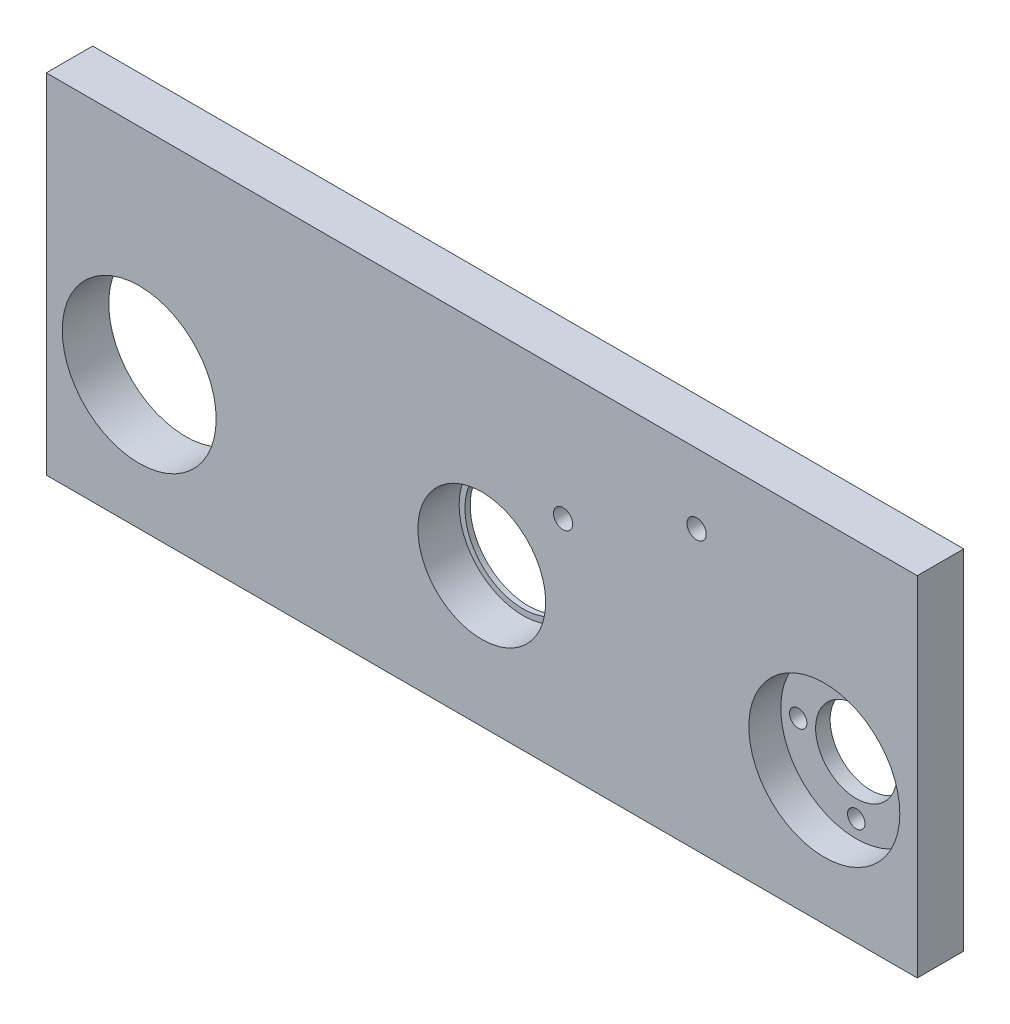
ISO-10303-21;
HEADER;
FILE_DESCRIPTION(('STEP AP214'),'2;1');
FILE_NAME('part.step','',(''),(''),'','','');
FILE_SCHEMA(('AUTOMOTIVE_DESIGN { 1 0 10303 214 1 1 1 1 }'));
ENDSEC;
DATA;
#1=APPLICATION_CONTEXT('core data for automotive mechanical design processes');
#2=APPLICATION_PROTOCOL_DEFINITION('international standard','automotive_design',2000,#1);
#3=PRODUCT_CONTEXT('',#1,'mechanical');
#4=PRODUCT('Part','Part','',(#3));
#5=PRODUCT_RELATED_PRODUCT_CATEGORY('part','',(#4));
#6=PRODUCT_DEFINITION_FORMATION('','',#4);
#7=PRODUCT_DEFINITION_CONTEXT('part definition',#1,'design');
#8=PRODUCT_DEFINITION('design','',#6,#7);
#9=PRODUCT_DEFINITION_SHAPE('','',#8);
#10=(LENGTH_UNIT() NAMED_UNIT(*) SI_UNIT(.MILLI.,.METRE.));
#11=(NAMED_UNIT(*) PLANE_ANGLE_UNIT() SI_UNIT($,.RADIAN.));
#12=(NAMED_UNIT(*) SI_UNIT($,.STERADIAN.) SOLID_ANGLE_UNIT());
#13=UNCERTAINTY_MEASURE_WITH_UNIT(LENGTH_MEASURE(1.E-05),#10,'distance_accuracy_value','');
#14=(GEOMETRIC_REPRESENTATION_CONTEXT(3) GLOBAL_UNCERTAINTY_ASSIGNED_CONTEXT((#13)) GLOBAL_UNIT_ASSIGNED_CONTEXT((#10,
#11,#12)) REPRESENTATION_CONTEXT('',''));
#15=CARTESIAN_POINT('',(0.,0.,0.));
#16=DIRECTION('',(0.,0.,1.));
#17=DIRECTION('',(1.,0.,0.));
#18=AXIS2_PLACEMENT_3D('',#15,#16,#17);
#19=CARTESIAN_POINT('',(133.991524815011,23.,0.));
#20=DIRECTION('',(0.,0.,1.));
#21=DIRECTION('',(1.,0.,0.));
#22=AXIS2_PLACEMENT_3D('',#19,#20,#21);
#23=CYLINDRICAL_SURFACE('',#22,7.00000000000001);
#24=CARTESIAN_POINT('',(133.991524815011,23.,0.));
#25=DIRECTION('',(0.,0.,1.));
#26=DIRECTION('',(1.,0.,0.));
#27=AXIS2_PLACEMENT_3D('',#24,#25,#26);
#28=CIRCLE('',#27,7.00000000000001);
#29=CARTESIAN_POINT('',(140.991524815011,23.,0.));
#30=VERTEX_POINT('',#29);
#31=EDGE_CURVE('E115',#30,#30,#28,.T.);
#32=ORIENTED_EDGE('',*,*,#31,.F.);
#33=EDGE_LOOP('',(#32));
#34=FACE_BOUND('',#33,.T.);
#35=CARTESIAN_POINT('',(133.991524815011,23.,2.5));
#36=DIRECTION('',(0.,0.,1.));
#37=DIRECTION('',(1.,0.,0.));
#38=AXIS2_PLACEMENT_3D('',#35,#36,#37);
#39=CIRCLE('',#38,7.00000000000001);
#40=CARTESIAN_POINT('',(140.991524815011,23.,2.5));
#41=VERTEX_POINT('',#40);
#42=EDGE_CURVE('E112',#41,#41,#39,.F.);
#43=ORIENTED_EDGE('',*,*,#42,.F.);
#44=EDGE_LOOP('',(#43));
#45=FACE_BOUND('',#44,.T.);
#46=ADVANCED_FACE('F33',(#34,#45),#23,.F.);
#47=CARTESIAN_POINT('',(0.,0.,8.));
#48=DIRECTION('',(1.,0.,0.));
#49=DIRECTION('',(0.,0.,-1.));
#50=AXIS2_PLACEMENT_3D('',#47,#48,#49);
#51=PLANE('',#50);
#52=DIRECTION('',(0.,-1.,0.));
#53=VECTOR('',#52,1.);
#54=CARTESIAN_POINT('',(0.,0.,0.));
#55=LINE('',#54,#53);
#56=CARTESIAN_POINT('',(0.,60.,0.));
#57=VERTEX_POINT('',#56);
#58=CARTESIAN_POINT('',(0.,0.,0.));
#59=VERTEX_POINT('',#58);
#60=EDGE_CURVE('E100',#57,#59,#55,.T.);
#61=ORIENTED_EDGE('',*,*,#60,.T.);
#62=DIRECTION('',(0.,0.,-1.));
#63=VECTOR('',#62,1.);
#64=CARTESIAN_POINT('',(0.,0.,8.));
#65=LINE('',#64,#63);
#66=CARTESIAN_POINT('',(0.,0.,8.));
#67=VERTEX_POINT('',#66);
#68=EDGE_CURVE('E11',#67,#59,#65,.T.);
#69=ORIENTED_EDGE('',*,*,#68,.F.);
#70=DIRECTION('',(0.,-1.,0.));
#71=VECTOR('',#70,1.);
#72=CARTESIAN_POINT('',(0.,0.,8.));
#73=LINE('',#72,#71);
#74=CARTESIAN_POINT('',(0.,60.,8.));
#75=VERTEX_POINT('',#74);
#76=EDGE_CURVE('E87',#75,#67,#73,.T.);
#77=ORIENTED_EDGE('',*,*,#76,.F.);
#78=DIRECTION('',(0.,0.,-1.));
#79=VECTOR('',#78,1.);
#80=CARTESIAN_POINT('',(0.,60.,8.));
#81=LINE('',#80,#79);
#82=EDGE_CURVE('E96',#75,#57,#81,.T.);
#83=ORIENTED_EDGE('',*,*,#82,.T.);
#84=EDGE_LOOP('',(#61,#69,#77,#83));
#85=FACE_BOUND('',#84,.T.);
#86=ADVANCED_FACE('F35',(#85),#51,.F.);
#87=CARTESIAN_POINT('',(0.,0.,8.));
#88=DIRECTION('',(0.,1.,0.));
#89=DIRECTION('',(0.,0.,1.));
#90=AXIS2_PLACEMENT_3D('',#87,#88,#89);
#91=PLANE('',#90);
#92=DIRECTION('',(1.,0.,0.));
#93=VECTOR('',#92,1.);
#94=CARTESIAN_POINT('',(0.,0.,0.));
#95=LINE('',#94,#93);
#96=CARTESIAN_POINT('',(150.,0.,0.));
#97=VERTEX_POINT('',#96);
#98=EDGE_CURVE('E91',#59,#97,#95,.T.);
#99=ORIENTED_EDGE('',*,*,#98,.T.);
#100=DIRECTION('',(0.,0.,-1.));
#101=VECTOR('',#100,1.);
#102=CARTESIAN_POINT('',(150.,0.,8.));
#103=LINE('',#102,#101);
#104=CARTESIAN_POINT('',(150.,0.,8.));
#105=VERTEX_POINT('',#104);
#106=EDGE_CURVE('E43',#105,#97,#103,.T.);
#107=ORIENTED_EDGE('',*,*,#106,.F.);
#108=DIRECTION('',(1.,0.,0.));
#109=VECTOR('',#108,1.);
#110=CARTESIAN_POINT('',(0.,0.,8.));
#111=LINE('',#110,#109);
#112=EDGE_CURVE('E82',#67,#105,#111,.T.);
#113=ORIENTED_EDGE('',*,*,#112,.F.);
#114=ORIENTED_EDGE('',*,*,#68,.T.);
#115=EDGE_LOOP('',(#99,#107,#113,#114));
#116=FACE_BOUND('',#115,.T.);
#117=ADVANCED_FACE('F90',(#116),#91,.F.);
#118=CARTESIAN_POINT('',(150.,0.,8.));
#119=DIRECTION('',(-1.,0.,0.));
#120=DIRECTION('',(0.,0.,1.));
#121=AXIS2_PLACEMENT_3D('',#118,#119,#120);
#122=PLANE('',#121);
#123=DIRECTION('',(0.,1.,0.));
#124=VECTOR('',#123,1.);
#125=CARTESIAN_POINT('',(150.,0.,0.));
#126=LINE('',#125,#124);
#127=CARTESIAN_POINT('',(150.,60.,0.));
#128=VERTEX_POINT('',#127);
#129=EDGE_CURVE('E69',#97,#128,#126,.T.);
#130=ORIENTED_EDGE('',*,*,#129,.T.);
#131=DIRECTION('',(0.,0.,-1.));
#132=VECTOR('',#131,1.);
#133=CARTESIAN_POINT('',(150.,60.,8.));
#134=LINE('',#133,#132);
#135=CARTESIAN_POINT('',(150.,60.,8.));
#136=VERTEX_POINT('',#135);
#137=EDGE_CURVE('E92',#136,#128,#134,.T.);
#138=ORIENTED_EDGE('',*,*,#137,.F.);
#139=DIRECTION('',(0.,1.,0.));
#140=VECTOR('',#139,1.);
#141=CARTESIAN_POINT('',(150.,0.,8.));
#142=LINE('',#141,#140);
#143=EDGE_CURVE('E85',#105,#136,#142,.T.);
#144=ORIENTED_EDGE('',*,*,#143,.F.);
#145=ORIENTED_EDGE('',*,*,#106,.T.);
#146=EDGE_LOOP('',(#130,#138,#144,#145));
#147=FACE_BOUND('',#146,.T.);
#148=ADVANCED_FACE('F94',(#147),#122,.F.);
#149=CARTESIAN_POINT('',(0.,60.,8.));
#150=DIRECTION('',(0.,-1.,0.));
#151=DIRECTION('',(0.,0.,-1.));
#152=AXIS2_PLACEMENT_3D('',#149,#150,#151);
#153=PLANE('',#152);
#154=DIRECTION('',(-1.,0.,0.));
#155=VECTOR('',#154,1.);
#156=CARTESIAN_POINT('',(0.,60.,0.));
#157=LINE('',#156,#155);
#158=EDGE_CURVE('E75',#128,#57,#157,.T.);
#159=ORIENTED_EDGE('',*,*,#158,.T.);
#160=ORIENTED_EDGE('',*,*,#82,.F.);
#161=DIRECTION('',(-1.,0.,0.));
#162=VECTOR('',#161,1.);
#163=CARTESIAN_POINT('',(0.,60.,8.));
#164=LINE('',#163,#162);
#165=EDGE_CURVE('E52',#136,#75,#164,.T.);
#166=ORIENTED_EDGE('',*,*,#165,.F.);
#167=ORIENTED_EDGE('',*,*,#137,.T.);
#168=EDGE_LOOP('',(#159,#160,#166,#167));
#169=FACE_BOUND('',#168,.T.);
#170=ADVANCED_FACE('F183',(#169),#153,.F.);
#171=CARTESIAN_POINT('',(0.,0.,8.));
#172=DIRECTION('',(0.,0.,-1.));
#173=DIRECTION('',(-1.,0.,0.));
#174=AXIS2_PLACEMENT_3D('',#171,#172,#173);
#175=PLANE('',#174);
#176=CARTESIAN_POINT('',(112.,48.,8.));
#177=DIRECTION('',(0.,0.,-1.));
#178=DIRECTION('',(-1.,0.,0.));
#179=AXIS2_PLACEMENT_3D('',#176,#177,#178);
#180=CIRCLE('',#179,1.65);
#181=CARTESIAN_POINT('',(110.35,48.,8.));
#182=VERTEX_POINT('',#181);
#183=EDGE_CURVE('E142',#182,#182,#180,.T.);
#184=ORIENTED_EDGE('',*,*,#183,.T.);
#185=EDGE_LOOP('',(#184));
#186=FACE_BOUND('',#185,.T.);
#187=CARTESIAN_POINT('',(89.,38.,8.));
#188=DIRECTION('',(0.,0.,-1.));
#189=DIRECTION('',(-1.,0.,0.));
#190=AXIS2_PLACEMENT_3D('',#187,#188,#189);
#191=CIRCLE('',#190,1.65);
#192=CARTESIAN_POINT('',(87.35,38.,8.));
#193=VERTEX_POINT('',#192);
#194=EDGE_CURVE('E148',#193,#193,#191,.T.);
#195=ORIENTED_EDGE('',*,*,#194,.T.);
#196=EDGE_LOOP('',(#195));
#197=FACE_BOUND('',#196,.T.);
#198=CARTESIAN_POINT('',(16.0084751849895,23.,8.));
#199=DIRECTION('',(0.,0.,-1.));
#200=DIRECTION('',(-1.,0.,0.));
#201=AXIS2_PLACEMENT_3D('',#198,#199,#200);
#202=CIRCLE('',#201,13.25);
#203=CARTESIAN_POINT('',(2.7584751849895,23.,8.));
#204=VERTEX_POINT('',#203);
#205=EDGE_CURVE('E154',#204,#204,#202,.T.);
#206=ORIENTED_EDGE('',*,*,#205,.T.);
#207=EDGE_LOOP('',(#206));
#208=FACE_BOUND('',#207,.T.);
#209=CARTESIAN_POINT('',(133.991524815011,23.,8.));
#210=DIRECTION('',(0.,0.,1.));
#211=DIRECTION('',(1.,0.,0.));
#212=AXIS2_PLACEMENT_3D('',#209,#210,#211);
#213=CIRCLE('',#212,13.);
#214=CARTESIAN_POINT('',(146.991524815011,23.,8.));
#215=VERTEX_POINT('',#214);
#216=EDGE_CURVE('E157',#215,#215,#213,.T.);
#217=ORIENTED_EDGE('',*,*,#216,.F.);
#218=EDGE_LOOP('',(#217));
#219=FACE_BOUND('',#218,.T.);
#220=CARTESIAN_POINT('',(75.,24.,8.));
#221=DIRECTION('',(0.,0.,-1.));
#222=DIRECTION('',(-1.,0.,0.));
#223=AXIS2_PLACEMENT_3D('',#220,#221,#222);
#224=CIRCLE('',#223,11.);
#225=CARTESIAN_POINT('',(64.,24.,8.));
#226=VERTEX_POINT('',#225);
#227=EDGE_CURVE('E103',#226,#226,#224,.F.);
#228=ORIENTED_EDGE('',*,*,#227,.F.);
#229=EDGE_LOOP('',(#228));
#230=FACE_BOUND('',#229,.T.);
#231=ORIENTED_EDGE('',*,*,#76,.T.);
#232=ORIENTED_EDGE('',*,*,#112,.T.);
#233=ORIENTED_EDGE('',*,*,#143,.T.);
#234=ORIENTED_EDGE('',*,*,#165,.T.);
#235=EDGE_LOOP('',(#231,#232,#233,#234));
#236=FACE_BOUND('',#235,.T.);
#237=ADVANCED_FACE('F83',(#186,#197,#208,#219,#230,#236),#175,.F.);
#238=CARTESIAN_POINT('',(0.,0.,0.));
#239=DIRECTION('',(0.,0.,-1.));
#240=DIRECTION('',(-1.,0.,0.));
#241=AXIS2_PLACEMENT_3D('',#238,#239,#240);
#242=PLANE('',#241);
#243=CARTESIAN_POINT('',(123.99152481501,23.,0.));
#244=DIRECTION('',(0.,0.,1.));
#245=DIRECTION('',(1.,0.,0.));
#246=AXIS2_PLACEMENT_3D('',#243,#244,#245);
#247=CIRCLE('',#246,1.5);
#248=CARTESIAN_POINT('',(125.49152481501,23.,0.));
#249=VERTEX_POINT('',#248);
#250=EDGE_CURVE('E125',#249,#249,#247,.T.);
#251=ORIENTED_EDGE('',*,*,#250,.T.);
#252=EDGE_LOOP('',(#251));
#253=FACE_BOUND('',#252,.T.);
#254=CARTESIAN_POINT('',(133.991524815011,33.,0.));
#255=DIRECTION('',(0.,0.,1.));
#256=DIRECTION('',(1.,0.,0.));
#257=AXIS2_PLACEMENT_3D('',#254,#255,#256);
#258=CIRCLE('',#257,1.5);
#259=CARTESIAN_POINT('',(135.491524815011,33.,0.));
#260=VERTEX_POINT('',#259);
#261=EDGE_CURVE('E315',#260,#260,#258,.T.);
#262=ORIENTED_EDGE('',*,*,#261,.T.);
#263=EDGE_LOOP('',(#262));
#264=FACE_BOUND('',#263,.T.);
#265=CARTESIAN_POINT('',(143.99152481501,23.,0.));
#266=DIRECTION('',(0.,0.,1.));
#267=DIRECTION('',(1.,0.,0.));
#268=AXIS2_PLACEMENT_3D('',#265,#266,#267);
#269=CIRCLE('',#268,1.5);
#270=CARTESIAN_POINT('',(145.49152481501,23.,0.));
#271=VERTEX_POINT('',#270);
#272=EDGE_CURVE('E138',#271,#271,#269,.T.);
#273=ORIENTED_EDGE('',*,*,#272,.T.);
#274=EDGE_LOOP('',(#273));
#275=FACE_BOUND('',#274,.T.);
#276=CARTESIAN_POINT('',(133.991524815011,13.,0.));
#277=DIRECTION('',(0.,0.,1.));
#278=DIRECTION('',(1.,0.,0.));
#279=AXIS2_PLACEMENT_3D('',#276,#277,#278);
#280=CIRCLE('',#279,1.5);
#281=CARTESIAN_POINT('',(135.491524815011,13.,0.));
#282=VERTEX_POINT('',#281);
#283=EDGE_CURVE('E121',#282,#282,#280,.T.);
#284=ORIENTED_EDGE('',*,*,#283,.T.);
#285=EDGE_LOOP('',(#284));
#286=FACE_BOUND('',#285,.T.);
#287=CARTESIAN_POINT('',(112.,48.,0.));
#288=DIRECTION('',(0.,0.,1.));
#289=DIRECTION('',(1.,0.,0.));
#290=AXIS2_PLACEMENT_3D('',#287,#288,#289);
#291=CIRCLE('',#290,1.65);
#292=CARTESIAN_POINT('',(113.65,48.,0.));
#293=VERTEX_POINT('',#292);
#294=EDGE_CURVE('E120',#293,#293,#291,.T.);
#295=ORIENTED_EDGE('',*,*,#294,.T.);
#296=EDGE_LOOP('',(#295));
#297=FACE_BOUND('',#296,.T.);
#298=CARTESIAN_POINT('',(89.,38.,0.));
#299=DIRECTION('',(0.,0.,1.));
#300=DIRECTION('',(1.,0.,0.));
#301=AXIS2_PLACEMENT_3D('',#298,#299,#300);
#302=CIRCLE('',#301,1.65);
#303=CARTESIAN_POINT('',(90.65,38.,0.));
#304=VERTEX_POINT('',#303);
#305=EDGE_CURVE('E145',#304,#304,#302,.T.);
#306=ORIENTED_EDGE('',*,*,#305,.T.);
#307=EDGE_LOOP('',(#306));
#308=FACE_BOUND('',#307,.T.);
#309=CARTESIAN_POINT('',(16.0084751849895,23.,0.));
#310=DIRECTION('',(0.,0.,1.));
#311=DIRECTION('',(1.,0.,0.));
#312=AXIS2_PLACEMENT_3D('',#309,#310,#311);
#313=CIRCLE('',#312,13.25);
#314=CARTESIAN_POINT('',(29.2584751849895,23.,0.));
#315=VERTEX_POINT('',#314);
#316=EDGE_CURVE('E151',#315,#315,#313,.T.);
#317=ORIENTED_EDGE('',*,*,#316,.T.);
#318=EDGE_LOOP('',(#317));
#319=FACE_BOUND('',#318,.T.);
#320=ORIENTED_EDGE('',*,*,#31,.T.);
#321=EDGE_LOOP('',(#320));
#322=FACE_BOUND('',#321,.T.);
#323=CARTESIAN_POINT('',(75.,24.,0.));
#324=DIRECTION('',(0.,0.,1.));
#325=DIRECTION('',(1.,0.,0.));
#326=AXIS2_PLACEMENT_3D('',#323,#324,#325);
#327=CIRCLE('',#326,9.99999999999999);
#328=CARTESIAN_POINT('',(85.,24.,0.));
#329=VERTEX_POINT('',#328);
#330=EDGE_CURVE('E165',#329,#329,#327,.T.);
#331=ORIENTED_EDGE('',*,*,#330,.T.);
#332=EDGE_LOOP('',(#331));
#333=FACE_BOUND('',#332,.T.);
#334=ORIENTED_EDGE('',*,*,#60,.F.);
#335=ORIENTED_EDGE('',*,*,#158,.F.);
#336=ORIENTED_EDGE('',*,*,#129,.F.);
#337=ORIENTED_EDGE('',*,*,#98,.F.);
#338=EDGE_LOOP('',(#334,#335,#336,#337));
#339=FACE_BOUND('',#338,.T.);
#340=ADVANCED_FACE('F178',(#253,#264,#275,#286,#297,#308,#319,#322,#333,#339),#242,.T.);
#341=CARTESIAN_POINT('',(75.,24.,8.000012));
#342=DIRECTION('',(0.,0.,-1.));
#343=DIRECTION('',(-1.,0.,0.));
#344=AXIS2_PLACEMENT_3D('',#341,#342,#343);
#345=CYLINDRICAL_SURFACE('',#344,11.);
#346=CARTESIAN_POINT('',(75.,24.,0.900000000000001));
#347=DIRECTION('',(0.,0.,1.));
#348=DIRECTION('',(1.,0.,0.));
#349=AXIS2_PLACEMENT_3D('',#346,#347,#348);
#350=CIRCLE('',#349,11.);
#351=CARTESIAN_POINT('',(64.,24.,0.900000000000001));
#352=VERTEX_POINT('',#351);
#353=EDGE_CURVE('E111',#352,#352,#350,.T.);
#354=CARTESIAN_POINT('',(64.,24.,0.900000000000001));
#355=CARTESIAN_POINT('',(64.,24.,0.973958333333334));
#356=CARTESIAN_POINT('',(64.,24.,1.04791666666667));
#357=CARTESIAN_POINT('',(64.,24.,1.19583333333333));
#358=CARTESIAN_POINT('',(64.,24.,1.26979166666667));
#359=CARTESIAN_POINT('',(64.,24.,1.41770833333333));
#360=CARTESIAN_POINT('',(64.,24.,1.49166666666667));
#361=CARTESIAN_POINT('',(64.,24.,1.63958333333333));
#362=CARTESIAN_POINT('',(64.,24.,1.71354166666667));
#363=CARTESIAN_POINT('',(64.,24.,1.86145833333333));
#364=CARTESIAN_POINT('',(64.,24.,1.93541666666667));
#365=CARTESIAN_POINT('',(64.,24.,2.08333333333333));
#366=CARTESIAN_POINT('',(64.,24.,2.15729166666667));
#367=CARTESIAN_POINT('',(64.,24.,2.30520833333333));
#368=CARTESIAN_POINT('',(64.,24.,2.37916666666667));
#369=CARTESIAN_POINT('',(64.,24.,2.52708333333333));
#370=CARTESIAN_POINT('',(64.,24.,2.60104166666667));
#371=CARTESIAN_POINT('',(64.,24.,2.74895833333333));
#372=CARTESIAN_POINT('',(64.,24.,2.82291666666667));
#373=CARTESIAN_POINT('',(64.,24.,2.97083333333333));
#374=CARTESIAN_POINT('',(64.,24.,3.04479166666667));
#375=CARTESIAN_POINT('',(64.,24.,3.19270833333333));
#376=CARTESIAN_POINT('',(64.,24.,3.26666666666667));
#377=CARTESIAN_POINT('',(64.,24.,3.41458333333333));
#378=CARTESIAN_POINT('',(64.,24.,3.48854166666667));
#379=CARTESIAN_POINT('',(64.,24.,3.63645833333333));
#380=CARTESIAN_POINT('',(64.,24.,3.71041666666667));
#381=CARTESIAN_POINT('',(64.,24.,3.85833333333333));
#382=CARTESIAN_POINT('',(64.,24.,3.93229166666667));
#383=CARTESIAN_POINT('',(64.,24.,4.08020833333333));
#384=CARTESIAN_POINT('',(64.,24.,4.15416666666667));
#385=CARTESIAN_POINT('',(64.,24.,4.30208333333333));
#386=CARTESIAN_POINT('',(64.,24.,4.37604166666667));
#387=CARTESIAN_POINT('',(64.,24.,4.52395833333333));
#388=CARTESIAN_POINT('',(64.,24.,4.59791666666667));
#389=CARTESIAN_POINT('',(64.,24.,4.74583333333333));
#390=CARTESIAN_POINT('',(64.,24.,4.81979166666667));
#391=CARTESIAN_POINT('',(64.,24.,4.96770833333333));
#392=CARTESIAN_POINT('',(64.,24.,5.04166666666667));
#393=CARTESIAN_POINT('',(64.,24.,5.18958333333333));
#394=CARTESIAN_POINT('',(64.,24.,5.26354166666667));
#395=CARTESIAN_POINT('',(64.,24.,5.41145833333333));
#396=CARTESIAN_POINT('',(64.,24.,5.48541666666667));
#397=CARTESIAN_POINT('',(64.,24.,5.63333333333333));
#398=CARTESIAN_POINT('',(64.,24.,5.70729166666667));
#399=CARTESIAN_POINT('',(64.,24.,5.85520833333333));
#400=CARTESIAN_POINT('',(64.,24.,5.92916666666667));
#401=CARTESIAN_POINT('',(64.,24.,6.07708333333333));
#402=CARTESIAN_POINT('',(64.,24.,6.15104166666667));
#403=CARTESIAN_POINT('',(64.,24.,6.29895833333333));
#404=CARTESIAN_POINT('',(64.,24.,6.37291666666667));
#405=CARTESIAN_POINT('',(64.,24.,6.52083333333333));
#406=CARTESIAN_POINT('',(64.,24.,6.59479166666667));
#407=CARTESIAN_POINT('',(64.,24.,6.74270833333333));
#408=CARTESIAN_POINT('',(64.,24.,6.81666666666667));
#409=CARTESIAN_POINT('',(64.,24.,6.96458333333333));
#410=CARTESIAN_POINT('',(64.,24.,7.03854166666667));
#411=CARTESIAN_POINT('',(64.,24.,7.18645833333333));
#412=CARTESIAN_POINT('',(64.,24.,7.26041666666667));
#413=CARTESIAN_POINT('',(64.,24.,7.40833333333333));
#414=CARTESIAN_POINT('',(64.,24.,7.48229166666667));
#415=CARTESIAN_POINT('',(64.,24.,7.63020833333333));
#416=CARTESIAN_POINT('',(64.,24.,7.70416666666667));
#417=CARTESIAN_POINT('',(64.,24.,7.85208333333333));
#418=CARTESIAN_POINT('',(64.,24.,7.92604166666667));
#419=CARTESIAN_POINT('',(64.,24.,8.));
#420=B_SPLINE_CURVE_WITH_KNOTS('',3,(#354,#355,#356,#357,#358,#359,#360,#361,#362,#363,#364,
#365,#366,#367,#368,#369,#370,#371,#372,#373,#374,#375,#376,#377,#378,#379,#380,#381,#382,#383,
#384,#385,#386,#387,#388,#389,#390,#391,#392,#393,#394,#395,#396,#397,#398,#399,#400,#401,#402,
#403,#404,#405,#406,#407,#408,#409,#410,#411,#412,#413,#414,#415,#416,#417,#418,#419),
.UNSPECIFIED.,.F.,.F.,(4,2,2,2,2,2,2,2,2,2,2,2,2,2,2,2,2,2,2,2,2,2,2,2,2,2,2,2,2,2,2,2,4),(0.,
0.221875,0.44375,0.665625,0.8875,1.109375,1.33125,1.553125,1.775,1.996875,2.21875,2.440625,
2.6625,2.884375,3.10625,3.328125,3.55,3.771875,3.99375,4.215625,4.4375,4.659375,4.88125,
5.103125,5.325,5.546875,5.76875,5.990625,6.2125,6.434375,6.65625,6.878125,7.1),.UNSPECIFIED.);
#421=EDGE_CURVE('BSEAM175',#352,#226,#420,.T.);
#422=ORIENTED_EDGE('',*,*,#353,.F.);
#423=ORIENTED_EDGE('',*,*,#227,.T.);
#424=ORIENTED_EDGE('',*,*,#421,.T.);
#425=ORIENTED_EDGE('',*,*,#421,.F.);
#426=EDGE_LOOP('',(#422,#424,#423,#425));
#427=FACE_BOUND('',#426,.T.);
#428=ADVANCED_FACE('F175',(#427),#345,.F.);
#429=CARTESIAN_POINT('',(75.,24.,0.900000000000001));
#430=DIRECTION('',(0.,0.,1.));
#431=DIRECTION('',(1.,0.,0.));
#432=AXIS2_PLACEMENT_3D('',#429,#430,#431);
#433=PLANE('',#432);
#434=CARTESIAN_POINT('',(75.,24.,0.900000000000001));
#435=DIRECTION('',(0.,0.,1.));
#436=DIRECTION('',(1.,0.,0.));
#437=AXIS2_PLACEMENT_3D('',#434,#435,#436);
#438=CIRCLE('',#437,9.99999999999999);
#439=CARTESIAN_POINT('',(85.,24.,0.900000000000001));
#440=VERTEX_POINT('',#439);
#441=EDGE_CURVE('E164',#440,#440,#438,.T.);
#442=ORIENTED_EDGE('',*,*,#441,.F.);
#443=EDGE_LOOP('',(#442));
#444=FACE_BOUND('',#443,.T.);
#445=ORIENTED_EDGE('',*,*,#353,.T.);
#446=EDGE_LOOP('',(#445));
#447=FACE_BOUND('',#446,.T.);
#448=ADVANCED_FACE('F173',(#444,#447),#433,.T.);
#449=CARTESIAN_POINT('',(75.,24.,0.));
#450=DIRECTION('',(0.,0.,1.));
#451=DIRECTION('',(1.,0.,0.));
#452=AXIS2_PLACEMENT_3D('',#449,#450,#451);
#453=CYLINDRICAL_SURFACE('',#452,9.99999999999999);
#454=ORIENTED_EDGE('',*,*,#330,.F.);
#455=EDGE_LOOP('',(#454));
#456=FACE_BOUND('',#455,.T.);
#457=ORIENTED_EDGE('',*,*,#441,.T.);
#458=EDGE_LOOP('',(#457));
#459=FACE_BOUND('',#458,.T.);
#460=ADVANCED_FACE('F209',(#456,#459),#453,.F.);
#461=CARTESIAN_POINT('',(133.991524815011,23.,2.5));
#462=DIRECTION('',(0.,0.,1.));
#463=DIRECTION('',(1.,0.,0.));
#464=AXIS2_PLACEMENT_3D('',#461,#462,#463);
#465=PLANE('',#464);
#466=CARTESIAN_POINT('',(123.99152481501,23.,2.5));
#467=DIRECTION('',(0.,0.,1.));
#468=DIRECTION('',(1.,0.,0.));
#469=AXIS2_PLACEMENT_3D('',#466,#467,#468);
#470=CIRCLE('',#469,1.5);
#471=CARTESIAN_POINT('',(125.49152481501,23.,2.5));
#472=VERTEX_POINT('',#471);
#473=EDGE_CURVE('E37',#472,#472,#470,.T.);
#474=ORIENTED_EDGE('',*,*,#473,.F.);
#475=EDGE_LOOP('',(#474));
#476=FACE_BOUND('',#475,.T.);
#477=CARTESIAN_POINT('',(133.991524815011,33.,2.5));
#478=DIRECTION('',(0.,0.,1.));
#479=DIRECTION('',(1.,0.,0.));
#480=AXIS2_PLACEMENT_3D('',#477,#478,#479);
#481=CIRCLE('',#480,1.5);
#482=CARTESIAN_POINT('',(135.491524815011,33.,2.5));
#483=VERTEX_POINT('',#482);
#484=EDGE_CURVE('E124',#483,#483,#481,.T.);
#485=ORIENTED_EDGE('',*,*,#484,.F.);
#486=EDGE_LOOP('',(#485));
#487=FACE_BOUND('',#486,.T.);
#488=CARTESIAN_POINT('',(143.99152481501,23.,2.5));
#489=DIRECTION('',(0.,0.,1.));
#490=DIRECTION('',(1.,0.,0.));
#491=AXIS2_PLACEMENT_3D('',#488,#489,#490);
#492=CIRCLE('',#491,1.5);
#493=CARTESIAN_POINT('',(145.49152481501,23.,2.5));
#494=VERTEX_POINT('',#493);
#495=EDGE_CURVE('E122',#494,#494,#492,.T.);
#496=ORIENTED_EDGE('',*,*,#495,.F.);
#497=EDGE_LOOP('',(#496));
#498=FACE_BOUND('',#497,.T.);
#499=CARTESIAN_POINT('',(133.991524815011,13.,2.5));
#500=DIRECTION('',(0.,0.,1.));
#501=DIRECTION('',(1.,0.,0.));
#502=AXIS2_PLACEMENT_3D('',#499,#500,#501);
#503=CIRCLE('',#502,1.5);
#504=CARTESIAN_POINT('',(135.491524815011,13.,2.5));
#505=VERTEX_POINT('',#504);
#506=EDGE_CURVE('E117',#505,#505,#503,.T.);
#507=ORIENTED_EDGE('',*,*,#506,.F.);
#508=EDGE_LOOP('',(#507));
#509=FACE_BOUND('',#508,.T.);
#510=CARTESIAN_POINT('',(133.991524815011,23.,2.5));
#511=DIRECTION('',(0.,0.,1.));
#512=DIRECTION('',(1.,0.,0.));
#513=AXIS2_PLACEMENT_3D('',#510,#511,#512);
#514=CIRCLE('',#513,13.);
#515=CARTESIAN_POINT('',(146.991524815011,23.,2.5));
#516=VERTEX_POINT('',#515);
#517=EDGE_CURVE('E116',#516,#516,#514,.T.);
#518=ORIENTED_EDGE('',*,*,#517,.T.);
#519=EDGE_LOOP('',(#518));
#520=FACE_BOUND('',#519,.T.);
#521=ORIENTED_EDGE('',*,*,#42,.T.);
#522=EDGE_LOOP('',(#521));
#523=FACE_BOUND('',#522,.T.);
#524=ADVANCED_FACE('F212',(#476,#487,#498,#509,#520,#523),#465,.T.);
#525=CARTESIAN_POINT('',(133.991524815011,23.,2.5));
#526=DIRECTION('',(0.,0.,1.));
#527=DIRECTION('',(1.,0.,0.));
#528=AXIS2_PLACEMENT_3D('',#525,#526,#527);
#529=CYLINDRICAL_SURFACE('',#528,13.);
#530=ORIENTED_EDGE('',*,*,#517,.F.);
#531=EDGE_LOOP('',(#530));
#532=FACE_BOUND('',#531,.T.);
#533=ORIENTED_EDGE('',*,*,#216,.T.);
#534=EDGE_LOOP('',(#533));
#535=FACE_BOUND('',#534,.T.);
#536=ADVANCED_FACE('F207',(#532,#535),#529,.F.);
#537=CARTESIAN_POINT('',(16.0084751849895,23.,0.));
#538=DIRECTION('',(0.,0.,1.));
#539=DIRECTION('',(1.,0.,0.));
#540=AXIS2_PLACEMENT_3D('',#537,#538,#539);
#541=CYLINDRICAL_SURFACE('',#540,13.25);
#542=ORIENTED_EDGE('',*,*,#316,.F.);
#543=EDGE_LOOP('',(#542));
#544=FACE_BOUND('',#543,.T.);
#545=ORIENTED_EDGE('',*,*,#205,.F.);
#546=EDGE_LOOP('',(#545));
#547=FACE_BOUND('',#546,.T.);
#548=ADVANCED_FACE('F244',(#544,#547),#541,.F.);
#549=CARTESIAN_POINT('',(89.,38.,0.));
#550=DIRECTION('',(0.,0.,1.));
#551=DIRECTION('',(1.,0.,0.));
#552=AXIS2_PLACEMENT_3D('',#549,#550,#551);
#553=CYLINDRICAL_SURFACE('',#552,1.65);
#554=ORIENTED_EDGE('',*,*,#305,.F.);
#555=EDGE_LOOP('',(#554));
#556=FACE_BOUND('',#555,.T.);
#557=ORIENTED_EDGE('',*,*,#194,.F.);
#558=EDGE_LOOP('',(#557));
#559=FACE_BOUND('',#558,.T.);
#560=ADVANCED_FACE('F249',(#556,#559),#553,.F.);
#561=CARTESIAN_POINT('',(112.,48.,0.));
#562=DIRECTION('',(0.,0.,1.));
#563=DIRECTION('',(1.,0.,0.));
#564=AXIS2_PLACEMENT_3D('',#561,#562,#563);
#565=CYLINDRICAL_SURFACE('',#564,1.65);
#566=ORIENTED_EDGE('',*,*,#294,.F.);
#567=EDGE_LOOP('',(#566));
#568=FACE_BOUND('',#567,.T.);
#569=ORIENTED_EDGE('',*,*,#183,.F.);
#570=EDGE_LOOP('',(#569));
#571=FACE_BOUND('',#570,.T.);
#572=ADVANCED_FACE('F256',(#568,#571),#565,.F.);
#573=CARTESIAN_POINT('',(133.991524815011,13.,0.));
#574=DIRECTION('',(0.,0.,1.));
#575=DIRECTION('',(1.,0.,0.));
#576=AXIS2_PLACEMENT_3D('',#573,#574,#575);
#577=CYLINDRICAL_SURFACE('',#576,1.5);
#578=ORIENTED_EDGE('',*,*,#506,.T.);
#579=EDGE_LOOP('',(#578));
#580=FACE_BOUND('',#579,.T.);
#581=ORIENTED_EDGE('',*,*,#283,.F.);
#582=EDGE_LOOP('',(#581));
#583=FACE_BOUND('',#582,.T.);
#584=ADVANCED_FACE('F264',(#580,#583),#577,.F.);
#585=CARTESIAN_POINT('',(143.99152481501,23.,0.));
#586=DIRECTION('',(0.,0.,1.));
#587=DIRECTION('',(1.,0.,0.));
#588=AXIS2_PLACEMENT_3D('',#585,#586,#587);
#589=CYLINDRICAL_SURFACE('',#588,1.5);
#590=ORIENTED_EDGE('',*,*,#495,.T.);
#591=EDGE_LOOP('',(#590));
#592=FACE_BOUND('',#591,.T.);
#593=ORIENTED_EDGE('',*,*,#272,.F.);
#594=EDGE_LOOP('',(#593));
#595=FACE_BOUND('',#594,.T.);
#596=ADVANCED_FACE('F271',(#592,#595),#589,.F.);
#597=CARTESIAN_POINT('',(133.991524815011,33.,0.));
#598=DIRECTION('',(0.,0.,1.));
#599=DIRECTION('',(1.,0.,0.));
#600=AXIS2_PLACEMENT_3D('',#597,#598,#599);
#601=CYLINDRICAL_SURFACE('',#600,1.5);
#602=ORIENTED_EDGE('',*,*,#484,.T.);
#603=EDGE_LOOP('',(#602));
#604=FACE_BOUND('',#603,.T.);
#605=ORIENTED_EDGE('',*,*,#261,.F.);
#606=EDGE_LOOP('',(#605));
#607=FACE_BOUND('',#606,.T.);
#608=ADVANCED_FACE('F279',(#604,#607),#601,.F.);
#609=CARTESIAN_POINT('',(123.99152481501,23.,0.));
#610=DIRECTION('',(0.,0.,1.));
#611=DIRECTION('',(1.,0.,0.));
#612=AXIS2_PLACEMENT_3D('',#609,#610,#611);
#613=CYLINDRICAL_SURFACE('',#612,1.5);
#614=ORIENTED_EDGE('',*,*,#473,.T.);
#615=EDGE_LOOP('',(#614));
#616=FACE_BOUND('',#615,.T.);
#617=ORIENTED_EDGE('',*,*,#250,.F.);
#618=EDGE_LOOP('',(#617));
#619=FACE_BOUND('',#618,.T.);
#620=ADVANCED_FACE('F287',(#616,#619),#613,.F.);
#621=CLOSED_SHELL('',(#46,#86,#117,#148,#170,#237,#340,#428,#448,#460,#524,#536,#548,#560,#572,
#584,#596,#608,#620));
#622=MANIFOLD_SOLID_BREP('B2',#621);
#623=ADVANCED_BREP_SHAPE_REPRESENTATION('',(#18,#622),#14);
#624=SHAPE_DEFINITION_REPRESENTATION(#9,#623);
ENDSEC;
END-ISO-10303-21;
